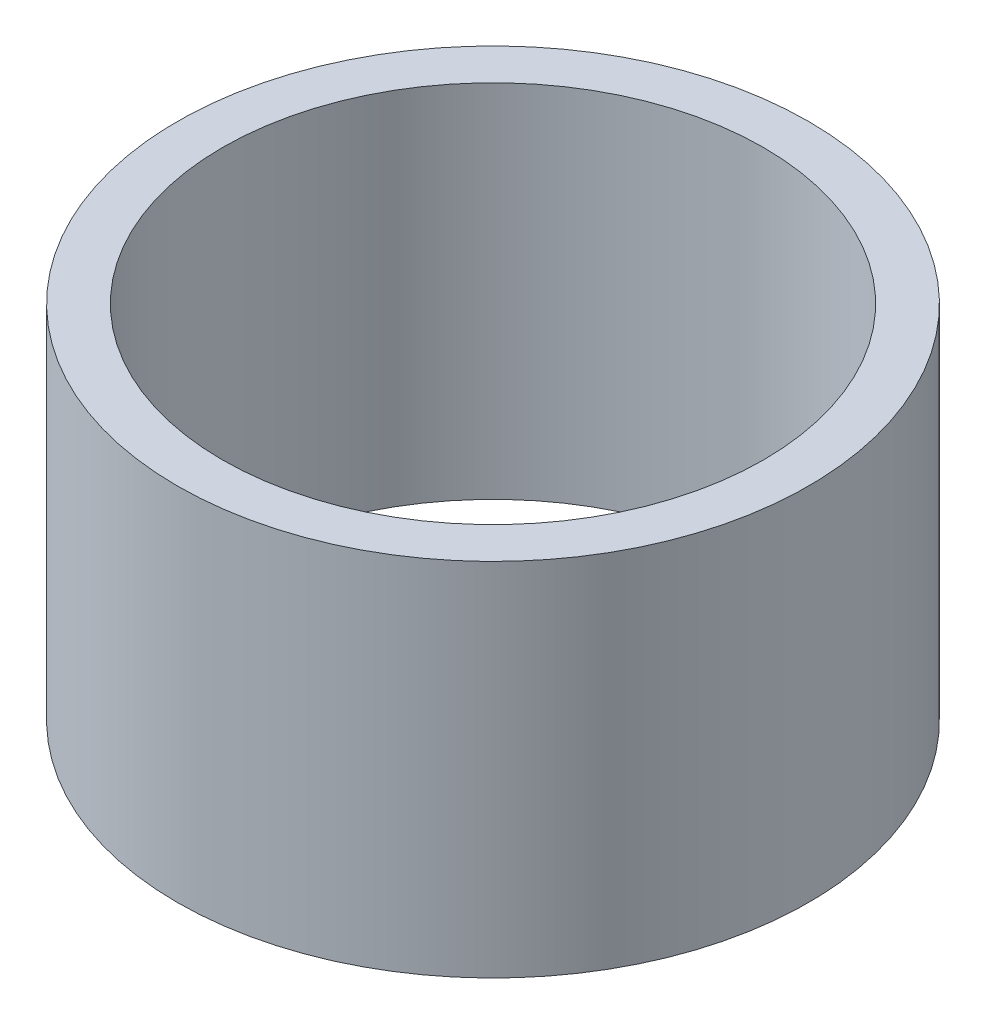
ISO-10303-21;
HEADER;
FILE_DESCRIPTION(('STEP AP214'),'2;1');
FILE_NAME('part.step','',(''),(''),'','','');
FILE_SCHEMA(('AUTOMOTIVE_DESIGN { 1 0 10303 214 1 1 1 1 }'));
ENDSEC;
DATA;
#1=APPLICATION_CONTEXT('core data for automotive mechanical design processes');
#2=APPLICATION_PROTOCOL_DEFINITION('international standard','automotive_design',2000,#1);
#3=PRODUCT_CONTEXT('',#1,'mechanical');
#4=PRODUCT('Part','Part','',(#3));
#5=PRODUCT_RELATED_PRODUCT_CATEGORY('part','',(#4));
#6=PRODUCT_DEFINITION_FORMATION('','',#4);
#7=PRODUCT_DEFINITION_CONTEXT('part definition',#1,'design');
#8=PRODUCT_DEFINITION('design','',#6,#7);
#9=PRODUCT_DEFINITION_SHAPE('','',#8);
#10=(LENGTH_UNIT() NAMED_UNIT(*) SI_UNIT(.MILLI.,.METRE.));
#11=(NAMED_UNIT(*) PLANE_ANGLE_UNIT() SI_UNIT($,.RADIAN.));
#12=(NAMED_UNIT(*) SI_UNIT($,.STERADIAN.) SOLID_ANGLE_UNIT());
#13=UNCERTAINTY_MEASURE_WITH_UNIT(LENGTH_MEASURE(1.E-05),#10,'distance_accuracy_value','');
#14=(GEOMETRIC_REPRESENTATION_CONTEXT(3) GLOBAL_UNCERTAINTY_ASSIGNED_CONTEXT((#13)) GLOBAL_UNIT_ASSIGNED_CONTEXT((#10,
#11,#12)) REPRESENTATION_CONTEXT('',''));
#15=CARTESIAN_POINT('',(0.,0.,0.));
#16=DIRECTION('',(0.,0.,1.));
#17=DIRECTION('',(1.,0.,0.));
#18=AXIS2_PLACEMENT_3D('',#15,#16,#17);
#19=CARTESIAN_POINT('',(0.,25.4,0.));
#20=DIRECTION('',(0.,-1.,0.));
#21=DIRECTION('',(0.,0.,-1.));
#22=AXIS2_PLACEMENT_3D('',#19,#20,#21);
#23=CYLINDRICAL_SURFACE('',#22,22.225);
#24=CARTESIAN_POINT('',(0.,25.4,0.));
#25=DIRECTION('',(0.,1.,0.));
#26=DIRECTION('',(0.,0.,1.));
#27=AXIS2_PLACEMENT_3D('',#24,#25,#26);
#28=CIRCLE('',#27,22.225);
#29=CARTESIAN_POINT('',(0.,25.4,22.225));
#30=VERTEX_POINT('',#29);
#31=EDGE_CURVE('E10',#30,#30,#28,.T.);
#32=ORIENTED_EDGE('',*,*,#31,.F.);
#33=EDGE_LOOP('',(#32));
#34=FACE_BOUND('',#33,.T.);
#35=CARTESIAN_POINT('',(0.,0.,0.));
#36=DIRECTION('',(0.,1.,0.));
#37=DIRECTION('',(0.,0.,1.));
#38=AXIS2_PLACEMENT_3D('',#35,#36,#37);
#39=CIRCLE('',#38,22.225);
#40=CARTESIAN_POINT('',(0.,0.,22.225));
#41=VERTEX_POINT('',#40);
#42=EDGE_CURVE('E36',#41,#41,#39,.T.);
#43=ORIENTED_EDGE('',*,*,#42,.T.);
#44=EDGE_LOOP('',(#43));
#45=FACE_BOUND('',#44,.T.);
#46=ADVANCED_FACE('F33',(#34,#45),#23,.T.);
#47=CARTESIAN_POINT('',(0.,25.4,0.));
#48=DIRECTION('',(0.,1.,0.));
#49=DIRECTION('',(0.,0.,1.));
#50=AXIS2_PLACEMENT_3D('',#47,#48,#49);
#51=PLANE('',#50);
#52=CARTESIAN_POINT('',(0.,25.4,0.));
#53=DIRECTION('',(0.,1.,0.));
#54=DIRECTION('',(0.,0.,1.));
#55=AXIS2_PLACEMENT_3D('',#52,#53,#54);
#56=CIRCLE('',#55,19.05);
#57=CARTESIAN_POINT('',(0.,25.4,19.05));
#58=VERTEX_POINT('',#57);
#59=EDGE_CURVE('E45',#58,#58,#56,.T.);
#60=ORIENTED_EDGE('',*,*,#59,.F.);
#61=EDGE_LOOP('',(#60));
#62=FACE_BOUND('',#61,.T.);
#63=ORIENTED_EDGE('',*,*,#31,.T.);
#64=EDGE_LOOP('',(#63));
#65=FACE_BOUND('',#64,.T.);
#66=ADVANCED_FACE('F60',(#62,#65),#51,.T.);
#67=CARTESIAN_POINT('',(0.,0.,0.));
#68=DIRECTION('',(0.,1.,0.));
#69=DIRECTION('',(0.,0.,1.));
#70=AXIS2_PLACEMENT_3D('',#67,#68,#69);
#71=PLANE('',#70);
#72=CARTESIAN_POINT('',(0.,0.,0.));
#73=DIRECTION('',(0.,1.,0.));
#74=DIRECTION('',(0.,0.,1.));
#75=AXIS2_PLACEMENT_3D('',#72,#73,#74);
#76=CIRCLE('',#75,19.05);
#77=CARTESIAN_POINT('',(0.,0.,19.05));
#78=VERTEX_POINT('',#77);
#79=EDGE_CURVE('E43',#78,#78,#76,.T.);
#80=ORIENTED_EDGE('',*,*,#79,.T.);
#81=EDGE_LOOP('',(#80));
#82=FACE_BOUND('',#81,.T.);
#83=ORIENTED_EDGE('',*,*,#42,.F.);
#84=EDGE_LOOP('',(#83));
#85=FACE_BOUND('',#84,.T.);
#86=ADVANCED_FACE('F51',(#82,#85),#71,.F.);
#87=CARTESIAN_POINT('',(0.,0.,0.));
#88=DIRECTION('',(0.,1.,0.));
#89=DIRECTION('',(0.,0.,1.));
#90=AXIS2_PLACEMENT_3D('',#87,#88,#89);
#91=CYLINDRICAL_SURFACE('',#90,19.05);
#92=ORIENTED_EDGE('',*,*,#79,.F.);
#93=EDGE_LOOP('',(#92));
#94=FACE_BOUND('',#93,.T.);
#95=ORIENTED_EDGE('',*,*,#59,.T.);
#96=EDGE_LOOP('',(#95));
#97=FACE_BOUND('',#96,.T.);
#98=ADVANCED_FACE('F54',(#94,#97),#91,.F.);
#99=CLOSED_SHELL('',(#46,#66,#86,#98));
#100=MANIFOLD_SOLID_BREP('B2',#99);
#101=ADVANCED_BREP_SHAPE_REPRESENTATION('',(#18,#100),#14);
#102=SHAPE_DEFINITION_REPRESENTATION(#9,#101);
ENDSEC;
END-ISO-10303-21;
